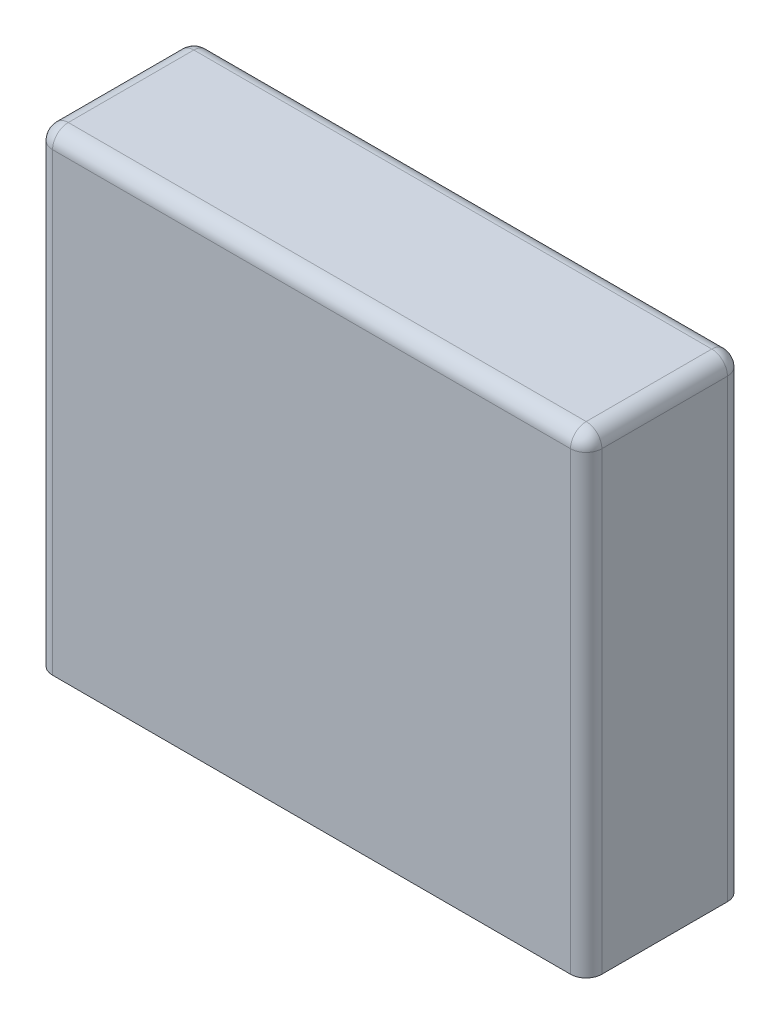
ISO-10303-21;
HEADER;
FILE_DESCRIPTION(('STEP AP214'),'2;1');
FILE_NAME('part.step','',(''),(''),'','','');
FILE_SCHEMA(('AUTOMOTIVE_DESIGN { 1 0 10303 214 1 1 1 1 }'));
ENDSEC;
DATA;
#1=APPLICATION_CONTEXT('core data for automotive mechanical design processes');
#2=APPLICATION_PROTOCOL_DEFINITION('international standard','automotive_design',2000,#1);
#3=PRODUCT_CONTEXT('',#1,'mechanical');
#4=PRODUCT('Part','Part','',(#3));
#5=PRODUCT_RELATED_PRODUCT_CATEGORY('part','',(#4));
#6=PRODUCT_DEFINITION_FORMATION('','',#4);
#7=PRODUCT_DEFINITION_CONTEXT('part definition',#1,'design');
#8=PRODUCT_DEFINITION('design','',#6,#7);
#9=PRODUCT_DEFINITION_SHAPE('','',#8);
#10=(LENGTH_UNIT() NAMED_UNIT(*) SI_UNIT(.MILLI.,.METRE.));
#11=(NAMED_UNIT(*) PLANE_ANGLE_UNIT() SI_UNIT($,.RADIAN.));
#12=(NAMED_UNIT(*) SI_UNIT($,.STERADIAN.) SOLID_ANGLE_UNIT());
#13=UNCERTAINTY_MEASURE_WITH_UNIT(LENGTH_MEASURE(1.E-05),#10,'distance_accuracy_value','');
#14=(GEOMETRIC_REPRESENTATION_CONTEXT(3) GLOBAL_UNCERTAINTY_ASSIGNED_CONTEXT((#13)) GLOBAL_UNIT_ASSIGNED_CONTEXT((#10,
#11,#12)) REPRESENTATION_CONTEXT('',''));
#15=CARTESIAN_POINT('',(0.,0.,0.));
#16=DIRECTION('',(0.,0.,1.));
#17=DIRECTION('',(1.,0.,0.));
#18=AXIS2_PLACEMENT_3D('',#15,#16,#17);
#19=CARTESIAN_POINT('',(3.5,3.,2.));
#20=DIRECTION('',(-1.,0.,0.));
#21=DIRECTION('',(0.,-1.,0.));
#22=AXIS2_PLACEMENT_3D('',#19,#20,#21);
#23=PLANE('',#22);
#24=DIRECTION('',(0.,0.,-1.));
#25=VECTOR('',#24,1.);
#26=CARTESIAN_POINT('',(3.5,2.8,2.));
#27=LINE('',#26,#25);
#28=CARTESIAN_POINT('',(3.5,2.8,0.2));
#29=VERTEX_POINT('',#28);
#30=CARTESIAN_POINT('',(3.5,2.8,1.8));
#31=VERTEX_POINT('',#30);
#32=EDGE_CURVE('E117',#29,#31,#27,.F.);
#33=ORIENTED_EDGE('',*,*,#32,.T.);
#34=DIRECTION('',(0.,1.,0.));
#35=VECTOR('',#34,1.);
#36=CARTESIAN_POINT('',(3.5,-3.,1.8));
#37=LINE('',#36,#35);
#38=CARTESIAN_POINT('',(3.5,-3.,1.8));
#39=VERTEX_POINT('',#38);
#40=EDGE_CURVE('E152',#31,#39,#37,.F.);
#41=ORIENTED_EDGE('',*,*,#40,.T.);
#42=DIRECTION('',(0.,0.,-1.));
#43=VECTOR('',#42,1.);
#44=CARTESIAN_POINT('',(3.5,-3.,2.));
#45=LINE('',#44,#43);
#46=CARTESIAN_POINT('',(3.5,-3.,0.2));
#47=VERTEX_POINT('',#46);
#48=EDGE_CURVE('E205',#39,#47,#45,.T.);
#49=ORIENTED_EDGE('',*,*,#48,.T.);
#50=DIRECTION('',(0.,1.,0.));
#51=VECTOR('',#50,1.);
#52=CARTESIAN_POINT('',(3.5,3.,0.2));
#53=LINE('',#52,#51);
#54=EDGE_CURVE('E145',#47,#29,#53,.T.);
#55=ORIENTED_EDGE('',*,*,#54,.T.);
#56=EDGE_LOOP('',(#33,#41,#49,#55));
#57=FACE_BOUND('',#56,.T.);
#58=ADVANCED_FACE('F32',(#57),#23,.F.);
#59=CARTESIAN_POINT('',(-3.5,3.,2.));
#60=DIRECTION('',(0.,-1.,0.));
#61=DIRECTION('',(0.,0.,-1.));
#62=AXIS2_PLACEMENT_3D('',#59,#60,#61);
#63=PLANE('',#62);
#64=DIRECTION('',(-1.,0.,0.));
#65=VECTOR('',#64,1.);
#66=CARTESIAN_POINT('',(3.5,3.,1.8));
#67=LINE('',#66,#65);
#68=CARTESIAN_POINT('',(-3.3,3.,1.8));
#69=VERTEX_POINT('',#68);
#70=CARTESIAN_POINT('',(3.3,3.,1.8));
#71=VERTEX_POINT('',#70);
#72=EDGE_CURVE('E143',#69,#71,#67,.F.);
#73=ORIENTED_EDGE('',*,*,#72,.T.);
#74=DIRECTION('',(0.,0.,-1.));
#75=VECTOR('',#74,1.);
#76=CARTESIAN_POINT('',(3.3,3.,2.));
#77=LINE('',#76,#75);
#78=CARTESIAN_POINT('',(3.3,3.,0.2));
#79=VERTEX_POINT('',#78);
#80=EDGE_CURVE('E115',#71,#79,#77,.T.);
#81=ORIENTED_EDGE('',*,*,#80,.T.);
#82=DIRECTION('',(-1.,0.,0.));
#83=VECTOR('',#82,1.);
#84=CARTESIAN_POINT('',(-3.5,3.,0.2));
#85=LINE('',#84,#83);
#86=CARTESIAN_POINT('',(-3.3,3.,0.2));
#87=VERTEX_POINT('',#86);
#88=EDGE_CURVE('E132',#79,#87,#85,.T.);
#89=ORIENTED_EDGE('',*,*,#88,.T.);
#90=DIRECTION('',(0.,0.,-1.));
#91=VECTOR('',#90,1.);
#92=CARTESIAN_POINT('',(-3.3,3.,2.));
#93=LINE('',#92,#91);
#94=EDGE_CURVE('E138',#87,#69,#93,.F.);
#95=ORIENTED_EDGE('',*,*,#94,.T.);
#96=EDGE_LOOP('',(#73,#81,#89,#95));
#97=FACE_BOUND('',#96,.T.);
#98=ADVANCED_FACE('F141',(#97),#63,.F.);
#99=CARTESIAN_POINT('',(-3.5,3.,2.));
#100=DIRECTION('',(1.,0.,0.));
#101=DIRECTION('',(0.,1.,0.));
#102=AXIS2_PLACEMENT_3D('',#99,#100,#101);
#103=PLANE('',#102);
#104=DIRECTION('',(0.,0.,-1.));
#105=VECTOR('',#104,1.);
#106=CARTESIAN_POINT('',(-3.5,-3.,2.));
#107=LINE('',#106,#105);
#108=CARTESIAN_POINT('',(-3.5,-3.,1.8));
#109=VERTEX_POINT('',#108);
#110=CARTESIAN_POINT('',(-3.5,-3.,0.2));
#111=VERTEX_POINT('',#110);
#112=EDGE_CURVE('E139',#109,#111,#107,.T.);
#113=ORIENTED_EDGE('',*,*,#112,.F.);
#114=DIRECTION('',(0.,-1.,0.));
#115=VECTOR('',#114,1.);
#116=CARTESIAN_POINT('',(-3.5,3.,1.8));
#117=LINE('',#116,#115);
#118=CARTESIAN_POINT('',(-3.5,2.8,1.8));
#119=VERTEX_POINT('',#118);
#120=EDGE_CURVE('E164',#109,#119,#117,.F.);
#121=ORIENTED_EDGE('',*,*,#120,.T.);
#122=DIRECTION('',(0.,0.,-1.));
#123=VECTOR('',#122,1.);
#124=CARTESIAN_POINT('',(-3.5,2.8,2.));
#125=LINE('',#124,#123);
#126=CARTESIAN_POINT('',(-3.5,2.8,0.2));
#127=VERTEX_POINT('',#126);
#128=EDGE_CURVE('E162',#119,#127,#125,.T.);
#129=ORIENTED_EDGE('',*,*,#128,.T.);
#130=DIRECTION('',(0.,-1.,0.));
#131=VECTOR('',#130,1.);
#132=CARTESIAN_POINT('',(-3.5,3.,0.2));
#133=LINE('',#132,#131);
#134=EDGE_CURVE('E160',#127,#111,#133,.T.);
#135=ORIENTED_EDGE('',*,*,#134,.T.);
#136=EDGE_LOOP('',(#113,#121,#129,#135));
#137=FACE_BOUND('',#136,.T.);
#138=ADVANCED_FACE('F253',(#137),#103,.F.);
#139=CARTESIAN_POINT('',(-3.5,-3.,2.));
#140=DIRECTION('',(0.,1.,0.));
#141=DIRECTION('',(0.,0.,1.));
#142=AXIS2_PLACEMENT_3D('',#139,#140,#141);
#143=PLANE('',#142);
#144=DIRECTION('',(1.,0.,0.));
#145=VECTOR('',#144,1.);
#146=CARTESIAN_POINT('',(-3.5,-3.,2.));
#147=LINE('',#146,#145);
#148=CARTESIAN_POINT('',(-3.3,-3.,2.));
#149=VERTEX_POINT('',#148);
#150=CARTESIAN_POINT('',(3.3,-3.,2.));
#151=VERTEX_POINT('',#150);
#152=EDGE_CURVE('E200',#149,#151,#147,.T.);
#153=ORIENTED_EDGE('',*,*,#152,.F.);
#154=CARTESIAN_POINT('',(-3.3,-3.,1.8));
#155=DIRECTION('',(0.,1.,0.));
#156=DIRECTION('',(0.,0.,1.));
#157=AXIS2_PLACEMENT_3D('',#154,#155,#156);
#158=CIRCLE('',#157,0.2);
#159=EDGE_CURVE('E11',#149,#109,#158,.F.);
#160=ORIENTED_EDGE('',*,*,#159,.T.);
#161=ORIENTED_EDGE('',*,*,#112,.T.);
#162=CARTESIAN_POINT('',(-3.3,-3.,0.2));
#163=DIRECTION('',(0.,1.,0.));
#164=DIRECTION('',(0.,0.,1.));
#165=AXIS2_PLACEMENT_3D('',#162,#163,#164);
#166=CIRCLE('',#165,0.2);
#167=CARTESIAN_POINT('',(-3.3,-3.,0.));
#168=VERTEX_POINT('',#167);
#169=EDGE_CURVE('E41',#111,#168,#166,.F.);
#170=ORIENTED_EDGE('',*,*,#169,.T.);
#171=DIRECTION('',(1.,0.,0.));
#172=VECTOR('',#171,1.);
#173=CARTESIAN_POINT('',(-3.5,-3.,0.));
#174=LINE('',#173,#172);
#175=CARTESIAN_POINT('',(3.3,-3.,0.));
#176=VERTEX_POINT('',#175);
#177=EDGE_CURVE('E197',#168,#176,#174,.T.);
#178=ORIENTED_EDGE('',*,*,#177,.T.);
#179=CARTESIAN_POINT('',(3.3,-3.,0.2));
#180=DIRECTION('',(0.,1.,0.));
#181=DIRECTION('',(0.,0.,1.));
#182=AXIS2_PLACEMENT_3D('',#179,#180,#181);
#183=CIRCLE('',#182,0.2);
#184=EDGE_CURVE('E170',#176,#47,#183,.F.);
#185=ORIENTED_EDGE('',*,*,#184,.T.);
#186=ORIENTED_EDGE('',*,*,#48,.F.);
#187=CARTESIAN_POINT('',(3.3,-3.,1.8));
#188=DIRECTION('',(0.,1.,0.));
#189=DIRECTION('',(0.,0.,1.));
#190=AXIS2_PLACEMENT_3D('',#187,#188,#189);
#191=CIRCLE('',#190,0.2);
#192=EDGE_CURVE('E172',#39,#151,#191,.F.);
#193=ORIENTED_EDGE('',*,*,#192,.T.);
#194=EDGE_LOOP('',(#153,#160,#161,#170,#178,#185,#186,#193));
#195=FACE_BOUND('',#194,.T.);
#196=ADVANCED_FACE('F366',(#195),#143,.F.);
#197=CARTESIAN_POINT('',(3.5,-3.,2.));
#198=DIRECTION('',(0.,0.,1.));
#199=DIRECTION('',(1.,0.,0.));
#200=AXIS2_PLACEMENT_3D('',#197,#198,#199);
#201=PLANE('',#200);
#202=DIRECTION('',(-1.,0.,0.));
#203=VECTOR('',#202,1.);
#204=CARTESIAN_POINT('',(-3.5,2.8,2.));
#205=LINE('',#204,#203);
#206=CARTESIAN_POINT('',(3.3,2.8,2.));
#207=VERTEX_POINT('',#206);
#208=CARTESIAN_POINT('',(-3.3,2.8,2.));
#209=VERTEX_POINT('',#208);
#210=EDGE_CURVE('E156',#207,#209,#205,.T.);
#211=ORIENTED_EDGE('',*,*,#210,.T.);
#212=DIRECTION('',(0.,-1.,0.));
#213=VECTOR('',#212,1.);
#214=CARTESIAN_POINT('',(-3.3,-3.,2.));
#215=LINE('',#214,#213);
#216=EDGE_CURVE('E158',#209,#149,#215,.T.);
#217=ORIENTED_EDGE('',*,*,#216,.T.);
#218=ORIENTED_EDGE('',*,*,#152,.T.);
#219=DIRECTION('',(0.,1.,0.));
#220=VECTOR('',#219,1.);
#221=CARTESIAN_POINT('',(3.3,3.,2.));
#222=LINE('',#221,#220);
#223=EDGE_CURVE('E154',#151,#207,#222,.T.);
#224=ORIENTED_EDGE('',*,*,#223,.T.);
#225=EDGE_LOOP('',(#211,#217,#218,#224));
#226=FACE_BOUND('',#225,.T.);
#227=ADVANCED_FACE('F357',(#226),#201,.T.);
#228=CARTESIAN_POINT('',(3.5,-3.,0.));
#229=DIRECTION('',(0.,0.,1.));
#230=DIRECTION('',(1.,0.,0.));
#231=AXIS2_PLACEMENT_3D('',#228,#229,#230);
#232=PLANE('',#231);
#233=ORIENTED_EDGE('',*,*,#177,.F.);
#234=DIRECTION('',(0.,-1.,0.));
#235=VECTOR('',#234,1.);
#236=CARTESIAN_POINT('',(-3.3,-3.,0.));
#237=LINE('',#236,#235);
#238=CARTESIAN_POINT('',(-3.3,2.8,0.));
#239=VERTEX_POINT('',#238);
#240=EDGE_CURVE('E49',#168,#239,#237,.F.);
#241=ORIENTED_EDGE('',*,*,#240,.T.);
#242=DIRECTION('',(-1.,0.,0.));
#243=VECTOR('',#242,1.);
#244=CARTESIAN_POINT('',(3.5,2.8,0.));
#245=LINE('',#244,#243);
#246=CARTESIAN_POINT('',(3.3,2.8,0.));
#247=VERTEX_POINT('',#246);
#248=EDGE_CURVE('E54',#239,#247,#245,.F.);
#249=ORIENTED_EDGE('',*,*,#248,.T.);
#250=DIRECTION('',(0.,1.,0.));
#251=VECTOR('',#250,1.);
#252=CARTESIAN_POINT('',(3.3,-3.,0.));
#253=LINE('',#252,#251);
#254=EDGE_CURVE('E166',#247,#176,#253,.F.);
#255=ORIENTED_EDGE('',*,*,#254,.T.);
#256=EDGE_LOOP('',(#233,#241,#249,#255));
#257=FACE_BOUND('',#256,.T.);
#258=ADVANCED_FACE('F233',(#257),#232,.F.);
#259=CARTESIAN_POINT('',(-3.3,-3.,1.8));
#260=DIRECTION('',(0.,1.,0.));
#261=DIRECTION('',(-1.,0.,0.));
#262=AXIS2_PLACEMENT_3D('',#259,#260,#261);
#263=CYLINDRICAL_SURFACE('',#262,0.2);
#264=ORIENTED_EDGE('',*,*,#159,.F.);
#265=ORIENTED_EDGE('',*,*,#216,.F.);
#266=CARTESIAN_POINT('',(-3.3,2.8,1.8));
#267=DIRECTION('',(0.,1.,0.));
#268=DIRECTION('',(0.,0.,1.));
#269=AXIS2_PLACEMENT_3D('',#266,#267,#268);
#270=CIRCLE('',#269,0.2);
#271=EDGE_CURVE('E36',#119,#209,#270,.T.);
#272=ORIENTED_EDGE('',*,*,#271,.F.);
#273=ORIENTED_EDGE('',*,*,#120,.F.);
#274=EDGE_LOOP('',(#264,#265,#272,#273));
#275=FACE_BOUND('',#274,.T.);
#276=ADVANCED_FACE('F34',(#275),#263,.T.);
#277=CARTESIAN_POINT('',(-3.3,2.8,2.));
#278=DIRECTION('',(0.,0.,-1.));
#279=DIRECTION('',(-1.,0.,0.));
#280=AXIS2_PLACEMENT_3D('',#277,#278,#279);
#281=CYLINDRICAL_SURFACE('',#280,0.2);
#282=CARTESIAN_POINT('',(-3.3,2.8,0.2));
#283=DIRECTION('',(0.,0.,-1.));
#284=DIRECTION('',(-1.,0.,0.));
#285=AXIS2_PLACEMENT_3D('',#282,#283,#284);
#286=CIRCLE('',#285,0.2);
#287=EDGE_CURVE('E189',#127,#87,#286,.T.);
#288=ORIENTED_EDGE('',*,*,#287,.F.);
#289=ORIENTED_EDGE('',*,*,#128,.F.);
#290=CARTESIAN_POINT('',(-3.3,2.8,1.8));
#291=DIRECTION('',(0.,0.,1.));
#292=DIRECTION('',(1.,0.,0.));
#293=AXIS2_PLACEMENT_3D('',#290,#291,#292);
#294=CIRCLE('',#293,0.2);
#295=EDGE_CURVE('E191',#69,#119,#294,.T.);
#296=ORIENTED_EDGE('',*,*,#295,.F.);
#297=ORIENTED_EDGE('',*,*,#94,.F.);
#298=EDGE_LOOP('',(#288,#289,#296,#297));
#299=FACE_BOUND('',#298,.T.);
#300=ADVANCED_FACE('F214',(#299),#281,.T.);
#301=CARTESIAN_POINT('',(-3.3,3.,0.2));
#302=DIRECTION('',(0.,-1.,0.));
#303=DIRECTION('',(1.,0.,0.));
#304=AXIS2_PLACEMENT_3D('',#301,#302,#303);
#305=CYLINDRICAL_SURFACE('',#304,0.2);
#306=ORIENTED_EDGE('',*,*,#169,.F.);
#307=ORIENTED_EDGE('',*,*,#134,.F.);
#308=CARTESIAN_POINT('',(-3.3,2.8,0.2));
#309=DIRECTION('',(0.,1.,0.));
#310=DIRECTION('',(0.,0.,1.));
#311=AXIS2_PLACEMENT_3D('',#308,#309,#310);
#312=CIRCLE('',#311,0.2);
#313=EDGE_CURVE('E186',#239,#127,#312,.T.);
#314=ORIENTED_EDGE('',*,*,#313,.F.);
#315=ORIENTED_EDGE('',*,*,#240,.F.);
#316=EDGE_LOOP('',(#306,#307,#314,#315));
#317=FACE_BOUND('',#316,.T.);
#318=ADVANCED_FACE('F236',(#317),#305,.T.);
#319=CARTESIAN_POINT('',(-3.3,2.8,1.8));
#320=DIRECTION('',(0.,0.,1.));
#321=DIRECTION('',(1.,0.,0.));
#322=AXIS2_PLACEMENT_3D('',#319,#320,#321);
#323=SPHERICAL_SURFACE('',#322,0.2);
#324=ORIENTED_EDGE('',*,*,#295,.T.);
#325=ORIENTED_EDGE('',*,*,#271,.T.);
#326=CARTESIAN_POINT('',(-3.3,2.8,1.8));
#327=DIRECTION('',(-1.,0.,0.));
#328=DIRECTION('',(0.,-1.,0.));
#329=AXIS2_PLACEMENT_3D('',#326,#327,#328);
#330=CIRCLE('',#329,0.2);
#331=EDGE_CURVE('E183',#69,#209,#330,.F.);
#332=ORIENTED_EDGE('',*,*,#331,.F.);
#333=EDGE_LOOP('',(#324,#325,#332));
#334=FACE_BOUND('',#333,.T.);
#335=ADVANCED_FACE('F215',(#334),#323,.T.);
#336=CARTESIAN_POINT('',(-3.3,2.8,0.2));
#337=DIRECTION('',(0.,0.,1.));
#338=DIRECTION('',(1.,0.,0.));
#339=AXIS2_PLACEMENT_3D('',#336,#337,#338);
#340=SPHERICAL_SURFACE('',#339,0.2);
#341=ORIENTED_EDGE('',*,*,#313,.T.);
#342=ORIENTED_EDGE('',*,*,#287,.T.);
#343=CARTESIAN_POINT('',(-3.3,2.8,0.2));
#344=DIRECTION('',(-1.,0.,0.));
#345=DIRECTION('',(0.,0.,1.));
#346=AXIS2_PLACEMENT_3D('',#343,#344,#345);
#347=CIRCLE('',#346,0.2);
#348=EDGE_CURVE('E135',#239,#87,#347,.F.);
#349=ORIENTED_EDGE('',*,*,#348,.F.);
#350=EDGE_LOOP('',(#341,#342,#349));
#351=FACE_BOUND('',#350,.T.);
#352=ADVANCED_FACE('F239',(#351),#340,.T.);
#353=CARTESIAN_POINT('',(3.3,-3.,1.8));
#354=DIRECTION('',(0.,-1.,0.));
#355=DIRECTION('',(1.,0.,0.));
#356=AXIS2_PLACEMENT_3D('',#353,#354,#355);
#357=CYLINDRICAL_SURFACE('',#356,0.2);
#358=ORIENTED_EDGE('',*,*,#192,.F.);
#359=ORIENTED_EDGE('',*,*,#40,.F.);
#360=CARTESIAN_POINT('',(3.3,2.8,1.8));
#361=DIRECTION('',(0.,1.,0.));
#362=DIRECTION('',(-1.,0.,0.));
#363=AXIS2_PLACEMENT_3D('',#360,#361,#362);
#364=CIRCLE('',#363,0.2);
#365=EDGE_CURVE('E179',#207,#31,#364,.T.);
#366=ORIENTED_EDGE('',*,*,#365,.F.);
#367=ORIENTED_EDGE('',*,*,#223,.F.);
#368=EDGE_LOOP('',(#358,#359,#366,#367));
#369=FACE_BOUND('',#368,.T.);
#370=ADVANCED_FACE('F227',(#369),#357,.T.);
#371=CARTESIAN_POINT('',(3.5,2.8,1.8));
#372=DIRECTION('',(1.,0.,0.));
#373=DIRECTION('',(0.,0.,-1.));
#374=AXIS2_PLACEMENT_3D('',#371,#372,#373);
#375=CYLINDRICAL_SURFACE('',#374,0.2);
#376=ORIENTED_EDGE('',*,*,#331,.T.);
#377=ORIENTED_EDGE('',*,*,#210,.F.);
#378=CARTESIAN_POINT('',(3.3,2.8,1.8));
#379=DIRECTION('',(1.,0.,0.));
#380=DIRECTION('',(0.,0.,-1.));
#381=AXIS2_PLACEMENT_3D('',#378,#379,#380);
#382=CIRCLE('',#381,0.2);
#383=EDGE_CURVE('E129',#71,#207,#382,.T.);
#384=ORIENTED_EDGE('',*,*,#383,.F.);
#385=ORIENTED_EDGE('',*,*,#72,.F.);
#386=EDGE_LOOP('',(#376,#377,#384,#385));
#387=FACE_BOUND('',#386,.T.);
#388=ADVANCED_FACE('F218',(#387),#375,.T.);
#389=CARTESIAN_POINT('',(-3.5,2.8,0.2));
#390=DIRECTION('',(-1.,0.,0.));
#391=DIRECTION('',(0.,0.,1.));
#392=AXIS2_PLACEMENT_3D('',#389,#390,#391);
#393=CYLINDRICAL_SURFACE('',#392,0.2);
#394=ORIENTED_EDGE('',*,*,#348,.T.);
#395=ORIENTED_EDGE('',*,*,#88,.F.);
#396=CARTESIAN_POINT('',(3.3,2.8,0.2));
#397=DIRECTION('',(1.,0.,0.));
#398=DIRECTION('',(0.,1.,0.));
#399=AXIS2_PLACEMENT_3D('',#396,#397,#398);
#400=CIRCLE('',#399,0.2);
#401=EDGE_CURVE('E123',#247,#79,#400,.T.);
#402=ORIENTED_EDGE('',*,*,#401,.F.);
#403=ORIENTED_EDGE('',*,*,#248,.F.);
#404=EDGE_LOOP('',(#394,#395,#402,#403));
#405=FACE_BOUND('',#404,.T.);
#406=ADVANCED_FACE('F133',(#405),#393,.T.);
#407=CARTESIAN_POINT('',(3.3,3.,0.2));
#408=DIRECTION('',(0.,1.,0.));
#409=DIRECTION('',(-1.,0.,0.));
#410=AXIS2_PLACEMENT_3D('',#407,#408,#409);
#411=CYLINDRICAL_SURFACE('',#410,0.2);
#412=ORIENTED_EDGE('',*,*,#184,.F.);
#413=ORIENTED_EDGE('',*,*,#254,.F.);
#414=CARTESIAN_POINT('',(3.3,2.8,0.2));
#415=DIRECTION('',(0.,1.,0.));
#416=DIRECTION('',(0.,0.,1.));
#417=AXIS2_PLACEMENT_3D('',#414,#415,#416);
#418=CIRCLE('',#417,0.2);
#419=EDGE_CURVE('E127',#29,#247,#418,.T.);
#420=ORIENTED_EDGE('',*,*,#419,.F.);
#421=ORIENTED_EDGE('',*,*,#54,.F.);
#422=EDGE_LOOP('',(#412,#413,#420,#421));
#423=FACE_BOUND('',#422,.T.);
#424=ADVANCED_FACE('F232',(#423),#411,.T.);
#425=CARTESIAN_POINT('',(3.3,2.8,1.8));
#426=DIRECTION('',(0.,0.,1.));
#427=DIRECTION('',(1.,0.,0.));
#428=AXIS2_PLACEMENT_3D('',#425,#426,#427);
#429=SPHERICAL_SURFACE('',#428,0.2);
#430=ORIENTED_EDGE('',*,*,#383,.T.);
#431=ORIENTED_EDGE('',*,*,#365,.T.);
#432=CARTESIAN_POINT('',(3.3,2.8,1.8));
#433=DIRECTION('',(0.,0.,1.));
#434=DIRECTION('',(1.,0.,0.));
#435=AXIS2_PLACEMENT_3D('',#432,#433,#434);
#436=CIRCLE('',#435,0.2);
#437=EDGE_CURVE('E120',#71,#31,#436,.F.);
#438=ORIENTED_EDGE('',*,*,#437,.F.);
#439=EDGE_LOOP('',(#430,#431,#438));
#440=FACE_BOUND('',#439,.T.);
#441=ADVANCED_FACE('F222',(#440),#429,.T.);
#442=CARTESIAN_POINT('',(3.3,2.8,0.2));
#443=DIRECTION('',(0.,0.,1.));
#444=DIRECTION('',(1.,0.,0.));
#445=AXIS2_PLACEMENT_3D('',#442,#443,#444);
#446=SPHERICAL_SURFACE('',#445,0.2);
#447=ORIENTED_EDGE('',*,*,#419,.T.);
#448=ORIENTED_EDGE('',*,*,#401,.T.);
#449=CARTESIAN_POINT('',(3.3,2.8,0.2));
#450=DIRECTION('',(0.,0.,-1.));
#451=DIRECTION('',(-1.,0.,0.));
#452=AXIS2_PLACEMENT_3D('',#449,#450,#451);
#453=CIRCLE('',#452,0.2);
#454=EDGE_CURVE('E111',#29,#79,#453,.F.);
#455=ORIENTED_EDGE('',*,*,#454,.F.);
#456=EDGE_LOOP('',(#447,#448,#455));
#457=FACE_BOUND('',#456,.T.);
#458=ADVANCED_FACE('F125',(#457),#446,.T.);
#459=CARTESIAN_POINT('',(3.3,2.8,2.));
#460=DIRECTION('',(0.,0.,-1.));
#461=DIRECTION('',(-1.,0.,0.));
#462=AXIS2_PLACEMENT_3D('',#459,#460,#461);
#463=CYLINDRICAL_SURFACE('',#462,0.2);
#464=ORIENTED_EDGE('',*,*,#437,.T.);
#465=ORIENTED_EDGE('',*,*,#32,.F.);
#466=ORIENTED_EDGE('',*,*,#454,.T.);
#467=ORIENTED_EDGE('',*,*,#80,.F.);
#468=EDGE_LOOP('',(#464,#465,#466,#467));
#469=FACE_BOUND('',#468,.T.);
#470=ADVANCED_FACE('F113',(#469),#463,.T.);
#471=CLOSED_SHELL('',(#58,#98,#138,#196,#227,#258,#276,#300,#318,#335,#352,#370,#388,#406,#424,
#441,#458,#470));
#472=MANIFOLD_SOLID_BREP('B2',#471);
#473=ADVANCED_BREP_SHAPE_REPRESENTATION('',(#18,#472),#14);
#474=SHAPE_DEFINITION_REPRESENTATION(#9,#473);
ENDSEC;
END-ISO-10303-21;
